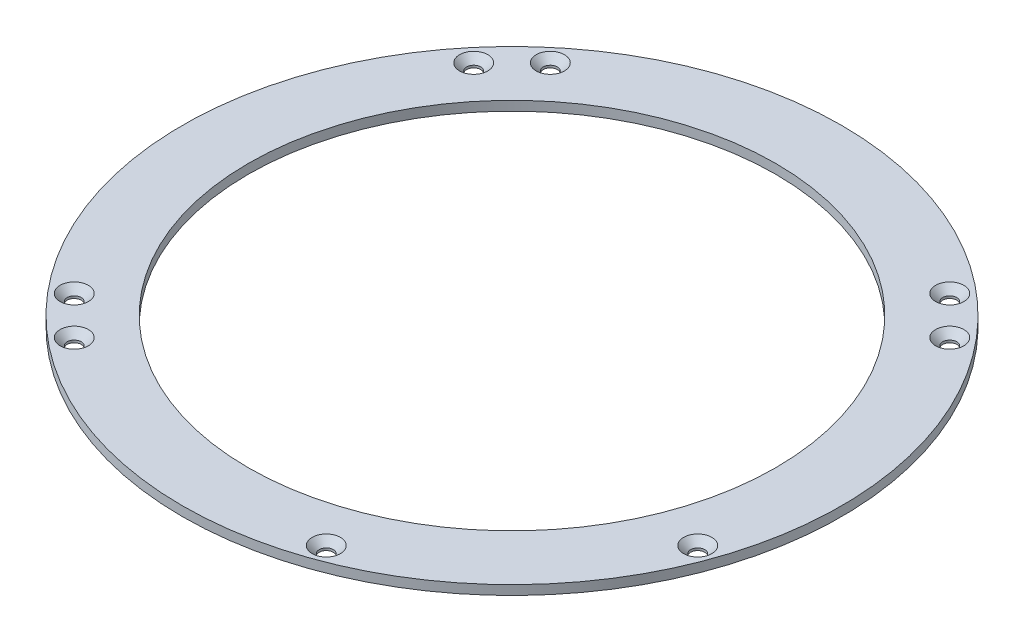
ISO-10303-21;
HEADER;
FILE_DESCRIPTION(('STEP AP214'),'2;1');
FILE_NAME('part.step','',(''),(''),'','','');
FILE_SCHEMA(('AUTOMOTIVE_DESIGN { 1 0 10303 214 1 1 1 1 }'));
ENDSEC;
DATA;
#1=APPLICATION_CONTEXT('core data for automotive mechanical design processes');
#2=APPLICATION_PROTOCOL_DEFINITION('international standard','automotive_design',2000,#1);
#3=PRODUCT_CONTEXT('',#1,'mechanical');
#4=PRODUCT('Part','Part','',(#3));
#5=PRODUCT_RELATED_PRODUCT_CATEGORY('part','',(#4));
#6=PRODUCT_DEFINITION_FORMATION('','',#4);
#7=PRODUCT_DEFINITION_CONTEXT('part definition',#1,'design');
#8=PRODUCT_DEFINITION('design','',#6,#7);
#9=PRODUCT_DEFINITION_SHAPE('','',#8);
#10=(LENGTH_UNIT() NAMED_UNIT(*) SI_UNIT(.MILLI.,.METRE.));
#11=(NAMED_UNIT(*) PLANE_ANGLE_UNIT() SI_UNIT($,.RADIAN.));
#12=(NAMED_UNIT(*) SI_UNIT($,.STERADIAN.) SOLID_ANGLE_UNIT());
#13=UNCERTAINTY_MEASURE_WITH_UNIT(LENGTH_MEASURE(1.E-05),#10,'distance_accuracy_value','');
#14=(GEOMETRIC_REPRESENTATION_CONTEXT(3) GLOBAL_UNCERTAINTY_ASSIGNED_CONTEXT((#13)) GLOBAL_UNIT_ASSIGNED_CONTEXT((#10,
#11,#12)) REPRESENTATION_CONTEXT('',''));
#15=CARTESIAN_POINT('',(0.,0.,0.));
#16=DIRECTION('',(0.,0.,1.));
#17=DIRECTION('',(1.,0.,0.));
#18=AXIS2_PLACEMENT_3D('',#15,#16,#17);
#19=CARTESIAN_POINT('',(0.,2.,0.));
#20=DIRECTION('',(0.,1.,0.));
#21=DIRECTION('',(0.,0.,1.));
#22=AXIS2_PLACEMENT_3D('',#19,#20,#21);
#23=PLANE('',#22);
#24=CARTESIAN_POINT('',(62.01971297187,2.,22.573329459494));
#25=DIRECTION('',(0.,1.,0.));
#26=DIRECTION('',(0.,0.,1.));
#27=AXIS2_PLACEMENT_3D('',#24,#25,#26);
#28=CIRCLE('',#27,2.99999999999998);
#29=CARTESIAN_POINT('',(62.01971297187,2.,25.5733294594939));
#30=VERTEX_POINT('',#29);
#31=EDGE_CURVE('E60',#30,#30,#28,.F.);
#32=ORIENTED_EDGE('',*,*,#31,.T.);
#33=EDGE_LOOP('',(#32));
#34=FACE_BOUND('',#33,.T.);
#35=CARTESIAN_POINT('',(50.5589332458526,2.,-42.4239822393115));
#36=DIRECTION('',(0.,1.,0.));
#37=DIRECTION('',(0.,0.,1.));
#38=AXIS2_PLACEMENT_3D('',#35,#36,#37);
#39=CIRCLE('',#38,3.00000000000003);
#40=CARTESIAN_POINT('',(50.5589332458526,2.,-39.4239822393115));
#41=VERTEX_POINT('',#40);
#42=EDGE_CURVE('E63',#41,#41,#39,.F.);
#43=ORIENTED_EDGE('',*,*,#42,.T.);
#44=EDGE_LOOP('',(#43));
#45=FACE_BOUND('',#44,.T.);
#46=CARTESIAN_POINT('',(42.4239822393117,2.,-50.5589332458525));
#47=DIRECTION('',(0.,1.,0.));
#48=DIRECTION('',(0.,0.,1.));
#49=AXIS2_PLACEMENT_3D('',#46,#47,#48);
#50=CIRCLE('',#49,3.00000000000003);
#51=CARTESIAN_POINT('',(42.4239822393117,2.,-47.5589332458525));
#52=VERTEX_POINT('',#51);
#53=EDGE_CURVE('E66',#52,#52,#50,.F.);
#54=ORIENTED_EDGE('',*,*,#53,.T.);
#55=EDGE_LOOP('',(#54));
#56=FACE_BOUND('',#55,.T.);
#57=CARTESIAN_POINT('',(-42.4239822393117,2.,-50.5589332458525));
#58=DIRECTION('',(0.,1.,0.));
#59=DIRECTION('',(0.,0.,1.));
#60=AXIS2_PLACEMENT_3D('',#57,#58,#59);
#61=CIRCLE('',#60,3.00000000000003);
#62=CARTESIAN_POINT('',(-42.4239822393117,2.,-47.5589332458525));
#63=VERTEX_POINT('',#62);
#64=EDGE_CURVE('E69',#63,#63,#61,.F.);
#65=ORIENTED_EDGE('',*,*,#64,.T.);
#66=EDGE_LOOP('',(#65));
#67=FACE_BOUND('',#66,.T.);
#68=CARTESIAN_POINT('',(-50.5589332458526,2.,-42.4239822393115));
#69=DIRECTION('',(0.,1.,0.));
#70=DIRECTION('',(0.,0.,1.));
#71=AXIS2_PLACEMENT_3D('',#68,#69,#70);
#72=CIRCLE('',#71,3.00000000000003);
#73=CARTESIAN_POINT('',(-50.5589332458526,2.,-39.4239822393115));
#74=VERTEX_POINT('',#73);
#75=EDGE_CURVE('E72',#74,#74,#72,.F.);
#76=ORIENTED_EDGE('',*,*,#75,.T.);
#77=EDGE_LOOP('',(#76));
#78=FACE_BOUND('',#77,.T.);
#79=CARTESIAN_POINT('',(-50.5589332458526,2.,42.4239822393115));
#80=DIRECTION('',(0.,1.,0.));
#81=DIRECTION('',(0.,0.,1.));
#82=AXIS2_PLACEMENT_3D('',#79,#80,#81);
#83=CIRCLE('',#82,3.00000000000003);
#84=CARTESIAN_POINT('',(-50.5589332458526,2.,45.4239822393115));
#85=VERTEX_POINT('',#84);
#86=EDGE_CURVE('E75',#85,#85,#83,.F.);
#87=ORIENTED_EDGE('',*,*,#86,.T.);
#88=EDGE_LOOP('',(#87));
#89=FACE_BOUND('',#88,.T.);
#90=CARTESIAN_POINT('',(-42.4239822393117,2.,50.5589332458525));
#91=DIRECTION('',(0.,1.,0.));
#92=DIRECTION('',(0.,0.,1.));
#93=AXIS2_PLACEMENT_3D('',#90,#91,#92);
#94=CIRCLE('',#93,3.00000000000003);
#95=CARTESIAN_POINT('',(-42.4239822393117,2.,53.5589332458525));
#96=VERTEX_POINT('',#95);
#97=EDGE_CURVE('E78',#96,#96,#94,.F.);
#98=ORIENTED_EDGE('',*,*,#97,.T.);
#99=EDGE_LOOP('',(#98));
#100=FACE_BOUND('',#99,.T.);
#101=CARTESIAN_POINT('',(22.5733294594942,2.,62.0197129718699));
#102=DIRECTION('',(0.,1.,0.));
#103=DIRECTION('',(0.,0.,1.));
#104=AXIS2_PLACEMENT_3D('',#101,#102,#103);
#105=CIRCLE('',#104,3.00000000000004);
#106=CARTESIAN_POINT('',(22.5733294594942,2.,65.01971297187));
#107=VERTEX_POINT('',#106);
#108=EDGE_CURVE('E81',#107,#107,#105,.F.);
#109=ORIENTED_EDGE('',*,*,#108,.T.);
#110=EDGE_LOOP('',(#109));
#111=FACE_BOUND('',#110,.T.);
#112=CARTESIAN_POINT('',(0.,2.,0.));
#113=DIRECTION('',(0.,1.,0.));
#114=DIRECTION('',(0.,0.,1.));
#115=AXIS2_PLACEMENT_3D('',#112,#113,#114);
#116=CIRCLE('',#115,70.);
#117=CARTESIAN_POINT('',(0.,2.,70.));
#118=VERTEX_POINT('',#117);
#119=EDGE_CURVE('E87',#118,#118,#116,.T.);
#120=ORIENTED_EDGE('',*,*,#119,.T.);
#121=EDGE_LOOP('',(#120));
#122=FACE_BOUND('',#121,.T.);
#123=CARTESIAN_POINT('',(0.,2.,0.));
#124=DIRECTION('',(0.,1.,0.));
#125=DIRECTION('',(0.,0.,1.));
#126=AXIS2_PLACEMENT_3D('',#123,#124,#125);
#127=CIRCLE('',#126,56.);
#128=CARTESIAN_POINT('',(0.,2.,56.));
#129=VERTEX_POINT('',#128);
#130=EDGE_CURVE('E116',#129,#129,#127,.T.);
#131=ORIENTED_EDGE('',*,*,#130,.F.);
#132=EDGE_LOOP('',(#131));
#133=FACE_BOUND('',#132,.T.);
#134=ADVANCED_FACE('F31',(#34,#45,#56,#67,#78,#89,#100,#111,#122,#133),#23,.T.);
#135=CARTESIAN_POINT('',(0.,0.,0.));
#136=DIRECTION('',(0.,1.,0.));
#137=DIRECTION('',(0.,0.,1.));
#138=AXIS2_PLACEMENT_3D('',#135,#136,#137);
#139=PLANE('',#138);
#140=CARTESIAN_POINT('',(50.5589332458526,0.,-42.4239822393115));
#141=DIRECTION('',(0.,1.,0.));
#142=DIRECTION('',(0.,0.,1.));
#143=AXIS2_PLACEMENT_3D('',#140,#141,#142);
#144=CIRCLE('',#143,1.50000000000001);
#145=CARTESIAN_POINT('',(50.5589332458526,0.,-40.9239822393115));
#146=VERTEX_POINT('',#145);
#147=EDGE_CURVE('E88',#146,#146,#144,.T.);
#148=ORIENTED_EDGE('',*,*,#147,.T.);
#149=EDGE_LOOP('',(#148));
#150=FACE_BOUND('',#149,.T.);
#151=CARTESIAN_POINT('',(22.5733294594942,0.,62.0197129718699));
#152=DIRECTION('',(0.,1.,0.));
#153=DIRECTION('',(0.,0.,1.));
#154=AXIS2_PLACEMENT_3D('',#151,#152,#153);
#155=CIRCLE('',#154,1.5);
#156=CARTESIAN_POINT('',(22.5733294594942,0.,63.5197129718699));
#157=VERTEX_POINT('',#156);
#158=EDGE_CURVE('E92',#157,#157,#155,.T.);
#159=ORIENTED_EDGE('',*,*,#158,.T.);
#160=EDGE_LOOP('',(#159));
#161=FACE_BOUND('',#160,.T.);
#162=CARTESIAN_POINT('',(-50.5589332458526,0.,-42.4239822393115));
#163=DIRECTION('',(0.,1.,0.));
#164=DIRECTION('',(0.,0.,1.));
#165=AXIS2_PLACEMENT_3D('',#162,#163,#164);
#166=CIRCLE('',#165,1.50000000000001);
#167=CARTESIAN_POINT('',(-50.5589332458526,0.,-40.9239822393115));
#168=VERTEX_POINT('',#167);
#169=EDGE_CURVE('E95',#168,#168,#166,.T.);
#170=ORIENTED_EDGE('',*,*,#169,.T.);
#171=EDGE_LOOP('',(#170));
#172=FACE_BOUND('',#171,.T.);
#173=CARTESIAN_POINT('',(-42.4239822393117,0.,-50.5589332458525));
#174=DIRECTION('',(0.,1.,0.));
#175=DIRECTION('',(0.,0.,1.));
#176=AXIS2_PLACEMENT_3D('',#173,#174,#175);
#177=CIRCLE('',#176,1.5);
#178=CARTESIAN_POINT('',(-42.4239822393117,0.,-49.0589332458525));
#179=VERTEX_POINT('',#178);
#180=EDGE_CURVE('E98',#179,#179,#177,.T.);
#181=ORIENTED_EDGE('',*,*,#180,.T.);
#182=EDGE_LOOP('',(#181));
#183=FACE_BOUND('',#182,.T.);
#184=CARTESIAN_POINT('',(-50.5589332458526,0.,42.4239822393115));
#185=DIRECTION('',(0.,1.,0.));
#186=DIRECTION('',(0.,0.,1.));
#187=AXIS2_PLACEMENT_3D('',#184,#185,#186);
#188=CIRCLE('',#187,1.50000000000001);
#189=CARTESIAN_POINT('',(-50.5589332458526,0.,43.9239822393115));
#190=VERTEX_POINT('',#189);
#191=EDGE_CURVE('E101',#190,#190,#188,.T.);
#192=ORIENTED_EDGE('',*,*,#191,.T.);
#193=EDGE_LOOP('',(#192));
#194=FACE_BOUND('',#193,.T.);
#195=CARTESIAN_POINT('',(-42.4239822393117,0.,50.5589332458525));
#196=DIRECTION('',(0.,1.,0.));
#197=DIRECTION('',(0.,0.,1.));
#198=AXIS2_PLACEMENT_3D('',#195,#196,#197);
#199=CIRCLE('',#198,1.5);
#200=CARTESIAN_POINT('',(-42.4239822393117,0.,52.0589332458525));
#201=VERTEX_POINT('',#200);
#202=EDGE_CURVE('E104',#201,#201,#199,.T.);
#203=ORIENTED_EDGE('',*,*,#202,.T.);
#204=EDGE_LOOP('',(#203));
#205=FACE_BOUND('',#204,.T.);
#206=CARTESIAN_POINT('',(62.01971297187,0.,22.573329459494));
#207=DIRECTION('',(0.,1.,0.));
#208=DIRECTION('',(0.,0.,1.));
#209=AXIS2_PLACEMENT_3D('',#206,#207,#208);
#210=CIRCLE('',#209,1.5);
#211=CARTESIAN_POINT('',(62.01971297187,0.,24.073329459494));
#212=VERTEX_POINT('',#211);
#213=EDGE_CURVE('E107',#212,#212,#210,.T.);
#214=ORIENTED_EDGE('',*,*,#213,.T.);
#215=EDGE_LOOP('',(#214));
#216=FACE_BOUND('',#215,.T.);
#217=CARTESIAN_POINT('',(42.4239822393117,0.,-50.5589332458525));
#218=DIRECTION('',(0.,1.,0.));
#219=DIRECTION('',(0.,0.,1.));
#220=AXIS2_PLACEMENT_3D('',#217,#218,#219);
#221=CIRCLE('',#220,1.5);
#222=CARTESIAN_POINT('',(42.4239822393117,0.,-49.0589332458525));
#223=VERTEX_POINT('',#222);
#224=EDGE_CURVE('E110',#223,#223,#221,.T.);
#225=ORIENTED_EDGE('',*,*,#224,.T.);
#226=EDGE_LOOP('',(#225));
#227=FACE_BOUND('',#226,.T.);
#228=CARTESIAN_POINT('',(0.,0.,0.));
#229=DIRECTION('',(0.,1.,0.));
#230=DIRECTION('',(0.,0.,1.));
#231=AXIS2_PLACEMENT_3D('',#228,#229,#230);
#232=CIRCLE('',#231,70.);
#233=CARTESIAN_POINT('',(0.,0.,70.));
#234=VERTEX_POINT('',#233);
#235=EDGE_CURVE('E113',#234,#234,#232,.T.);
#236=ORIENTED_EDGE('',*,*,#235,.F.);
#237=EDGE_LOOP('',(#236));
#238=FACE_BOUND('',#237,.T.);
#239=CARTESIAN_POINT('',(0.,0.,0.));
#240=DIRECTION('',(0.,1.,0.));
#241=DIRECTION('',(0.,0.,1.));
#242=AXIS2_PLACEMENT_3D('',#239,#240,#241);
#243=CIRCLE('',#242,56.);
#244=CARTESIAN_POINT('',(0.,0.,56.));
#245=VERTEX_POINT('',#244);
#246=EDGE_CURVE('E91',#245,#245,#243,.T.);
#247=ORIENTED_EDGE('',*,*,#246,.T.);
#248=EDGE_LOOP('',(#247));
#249=FACE_BOUND('',#248,.T.);
#250=ADVANCED_FACE('F128',(#150,#161,#172,#183,#194,#205,#216,#227,#238,#249),#139,.F.);
#251=CARTESIAN_POINT('',(0.,2.,0.));
#252=DIRECTION('',(0.,-1.,0.));
#253=DIRECTION('',(0.,0.,-1.));
#254=AXIS2_PLACEMENT_3D('',#251,#252,#253);
#255=CYLINDRICAL_SURFACE('',#254,70.);
#256=ORIENTED_EDGE('',*,*,#119,.F.);
#257=EDGE_LOOP('',(#256));
#258=FACE_BOUND('',#257,.T.);
#259=ORIENTED_EDGE('',*,*,#235,.T.);
#260=EDGE_LOOP('',(#259));
#261=FACE_BOUND('',#260,.T.);
#262=ADVANCED_FACE('F134',(#258,#261),#255,.T.);
#263=CARTESIAN_POINT('',(0.,2.,0.));
#264=DIRECTION('',(0.,-1.,0.));
#265=DIRECTION('',(0.,0.,-1.));
#266=AXIS2_PLACEMENT_3D('',#263,#264,#265);
#267=CYLINDRICAL_SURFACE('',#266,56.);
#268=ORIENTED_EDGE('',*,*,#130,.T.);
#269=EDGE_LOOP('',(#268));
#270=FACE_BOUND('',#269,.T.);
#271=ORIENTED_EDGE('',*,*,#246,.F.);
#272=EDGE_LOOP('',(#271));
#273=FACE_BOUND('',#272,.T.);
#274=ADVANCED_FACE('F124',(#270,#273),#267,.F.);
#275=CARTESIAN_POINT('',(42.4239822393117,-1.,-50.5589332458525));
#276=DIRECTION('',(0.,1.,0.));
#277=DIRECTION('',(0.,0.,1.));
#278=AXIS2_PLACEMENT_3D('',#275,#276,#277);
#279=CYLINDRICAL_SURFACE('',#278,1.5);
#280=CARTESIAN_POINT('',(42.4239822393117,0.499999999999996,-50.5589332458525));
#281=DIRECTION('',(0.,1.,0.));
#282=DIRECTION('',(0.,0.,1.));
#283=AXIS2_PLACEMENT_3D('',#280,#281,#282);
#284=CIRCLE('',#283,1.5);
#285=CARTESIAN_POINT('',(42.4239822393117,0.499999999999996,-49.0589332458525));
#286=VERTEX_POINT('',#285);
#287=EDGE_CURVE('E54',#286,#286,#284,.T.);
#288=ORIENTED_EDGE('',*,*,#287,.T.);
#289=EDGE_LOOP('',(#288));
#290=FACE_BOUND('',#289,.T.);
#291=ORIENTED_EDGE('',*,*,#224,.F.);
#292=EDGE_LOOP('',(#291));
#293=FACE_BOUND('',#292,.T.);
#294=ADVANCED_FACE('F188',(#290,#293),#279,.F.);
#295=CARTESIAN_POINT('',(62.01971297187,-1.,22.573329459494));
#296=DIRECTION('',(0.,1.,0.));
#297=DIRECTION('',(0.,0.,1.));
#298=AXIS2_PLACEMENT_3D('',#295,#296,#297);
#299=CYLINDRICAL_SURFACE('',#298,1.5);
#300=CARTESIAN_POINT('',(62.01971297187,0.500000000000017,22.573329459494));
#301=DIRECTION('',(0.,1.,0.));
#302=DIRECTION('',(0.,0.,1.));
#303=AXIS2_PLACEMENT_3D('',#300,#301,#302);
#304=CIRCLE('',#303,1.5);
#305=CARTESIAN_POINT('',(62.01971297187,0.500000000000017,24.073329459494));
#306=VERTEX_POINT('',#305);
#307=EDGE_CURVE('E84',#306,#306,#304,.T.);
#308=ORIENTED_EDGE('',*,*,#307,.T.);
#309=EDGE_LOOP('',(#308));
#310=FACE_BOUND('',#309,.T.);
#311=ORIENTED_EDGE('',*,*,#213,.F.);
#312=EDGE_LOOP('',(#311));
#313=FACE_BOUND('',#312,.T.);
#314=ADVANCED_FACE('F192',(#310,#313),#299,.F.);
#315=CARTESIAN_POINT('',(-42.4239822393117,-1.,50.5589332458525));
#316=DIRECTION('',(0.,1.,0.));
#317=DIRECTION('',(0.,0.,1.));
#318=AXIS2_PLACEMENT_3D('',#315,#316,#317);
#319=CYLINDRICAL_SURFACE('',#318,1.5);
#320=CARTESIAN_POINT('',(-42.4239822393117,0.499999999999996,50.5589332458525));
#321=DIRECTION('',(0.,1.,0.));
#322=DIRECTION('',(0.,0.,1.));
#323=AXIS2_PLACEMENT_3D('',#320,#321,#322);
#324=CIRCLE('',#323,1.5);
#325=CARTESIAN_POINT('',(-42.4239822393117,0.499999999999996,52.0589332458525));
#326=VERTEX_POINT('',#325);
#327=EDGE_CURVE('E38',#326,#326,#324,.T.);
#328=ORIENTED_EDGE('',*,*,#327,.T.);
#329=EDGE_LOOP('',(#328));
#330=FACE_BOUND('',#329,.T.);
#331=ORIENTED_EDGE('',*,*,#202,.F.);
#332=EDGE_LOOP('',(#331));
#333=FACE_BOUND('',#332,.T.);
#334=ADVANCED_FACE('F197',(#330,#333),#319,.F.);
#335=CARTESIAN_POINT('',(-50.5589332458526,-1.,42.4239822393115));
#336=DIRECTION('',(0.,1.,0.));
#337=DIRECTION('',(0.,0.,1.));
#338=AXIS2_PLACEMENT_3D('',#335,#336,#337);
#339=CYLINDRICAL_SURFACE('',#338,1.50000000000001);
#340=CARTESIAN_POINT('',(-50.5589332458526,0.500000000000005,42.4239822393115));
#341=DIRECTION('',(0.,1.,0.));
#342=DIRECTION('',(0.,0.,1.));
#343=AXIS2_PLACEMENT_3D('',#340,#341,#342);
#344=CIRCLE('',#343,1.50000000000001);
#345=CARTESIAN_POINT('',(-50.5589332458526,0.500000000000005,43.9239822393115));
#346=VERTEX_POINT('',#345);
#347=EDGE_CURVE('E42',#346,#346,#344,.T.);
#348=ORIENTED_EDGE('',*,*,#347,.T.);
#349=EDGE_LOOP('',(#348));
#350=FACE_BOUND('',#349,.T.);
#351=ORIENTED_EDGE('',*,*,#191,.F.);
#352=EDGE_LOOP('',(#351));
#353=FACE_BOUND('',#352,.T.);
#354=ADVANCED_FACE('F206',(#350,#353),#339,.F.);
#355=CARTESIAN_POINT('',(-42.4239822393117,-1.,-50.5589332458525));
#356=DIRECTION('',(0.,1.,0.));
#357=DIRECTION('',(0.,0.,1.));
#358=AXIS2_PLACEMENT_3D('',#355,#356,#357);
#359=CYLINDRICAL_SURFACE('',#358,1.5);
#360=CARTESIAN_POINT('',(-42.4239822393117,0.499999999999996,-50.5589332458525));
#361=DIRECTION('',(0.,1.,0.));
#362=DIRECTION('',(0.,0.,1.));
#363=AXIS2_PLACEMENT_3D('',#360,#361,#362);
#364=CIRCLE('',#363,1.5);
#365=CARTESIAN_POINT('',(-42.4239822393117,0.499999999999996,-49.0589332458525));
#366=VERTEX_POINT('',#365);
#367=EDGE_CURVE('E51',#366,#366,#364,.T.);
#368=ORIENTED_EDGE('',*,*,#367,.T.);
#369=EDGE_LOOP('',(#368));
#370=FACE_BOUND('',#369,.T.);
#371=ORIENTED_EDGE('',*,*,#180,.F.);
#372=EDGE_LOOP('',(#371));
#373=FACE_BOUND('',#372,.T.);
#374=ADVANCED_FACE('F202',(#370,#373),#359,.F.);
#375=CARTESIAN_POINT('',(-50.5589332458526,-1.,-42.4239822393115));
#376=DIRECTION('',(0.,1.,0.));
#377=DIRECTION('',(0.,0.,1.));
#378=AXIS2_PLACEMENT_3D('',#375,#376,#377);
#379=CYLINDRICAL_SURFACE('',#378,1.50000000000001);
#380=CARTESIAN_POINT('',(-50.5589332458526,0.500000000000005,-42.4239822393115));
#381=DIRECTION('',(0.,1.,0.));
#382=DIRECTION('',(0.,0.,1.));
#383=AXIS2_PLACEMENT_3D('',#380,#381,#382);
#384=CIRCLE('',#383,1.50000000000001);
#385=CARTESIAN_POINT('',(-50.5589332458526,0.500000000000005,-40.9239822393115));
#386=VERTEX_POINT('',#385);
#387=EDGE_CURVE('E46',#386,#386,#384,.T.);
#388=ORIENTED_EDGE('',*,*,#387,.T.);
#389=EDGE_LOOP('',(#388));
#390=FACE_BOUND('',#389,.T.);
#391=ORIENTED_EDGE('',*,*,#169,.F.);
#392=EDGE_LOOP('',(#391));
#393=FACE_BOUND('',#392,.T.);
#394=ADVANCED_FACE('F205',(#390,#393),#379,.F.);
#395=CARTESIAN_POINT('',(22.5733294594942,-1.,62.0197129718699));
#396=DIRECTION('',(0.,1.,0.));
#397=DIRECTION('',(0.,0.,1.));
#398=AXIS2_PLACEMENT_3D('',#395,#396,#397);
#399=CYLINDRICAL_SURFACE('',#398,1.5);
#400=CARTESIAN_POINT('',(22.5733294594942,0.499999999999993,62.0197129718699));
#401=DIRECTION('',(0.,1.,0.));
#402=DIRECTION('',(0.,0.,1.));
#403=AXIS2_PLACEMENT_3D('',#400,#401,#402);
#404=CIRCLE('',#403,1.5);
#405=CARTESIAN_POINT('',(22.5733294594942,0.499999999999993,63.5197129718699));
#406=VERTEX_POINT('',#405);
#407=EDGE_CURVE('E10',#406,#406,#404,.T.);
#408=ORIENTED_EDGE('',*,*,#407,.T.);
#409=EDGE_LOOP('',(#408));
#410=FACE_BOUND('',#409,.T.);
#411=ORIENTED_EDGE('',*,*,#158,.F.);
#412=EDGE_LOOP('',(#411));
#413=FACE_BOUND('',#412,.T.);
#414=ADVANCED_FACE('F210',(#410,#413),#399,.F.);
#415=CARTESIAN_POINT('',(50.5589332458526,-1.,-42.4239822393115));
#416=DIRECTION('',(0.,1.,0.));
#417=DIRECTION('',(0.,0.,1.));
#418=AXIS2_PLACEMENT_3D('',#415,#416,#417);
#419=CYLINDRICAL_SURFACE('',#418,1.50000000000001);
#420=CARTESIAN_POINT('',(50.5589332458526,0.500000000000005,-42.4239822393115));
#421=DIRECTION('',(0.,1.,0.));
#422=DIRECTION('',(0.,0.,1.));
#423=AXIS2_PLACEMENT_3D('',#420,#421,#422);
#424=CIRCLE('',#423,1.50000000000001);
#425=CARTESIAN_POINT('',(50.5589332458526,0.500000000000005,-40.9239822393115));
#426=VERTEX_POINT('',#425);
#427=EDGE_CURVE('E57',#426,#426,#424,.T.);
#428=ORIENTED_EDGE('',*,*,#427,.T.);
#429=EDGE_LOOP('',(#428));
#430=FACE_BOUND('',#429,.T.);
#431=ORIENTED_EDGE('',*,*,#147,.F.);
#432=EDGE_LOOP('',(#431));
#433=FACE_BOUND('',#432,.T.);
#434=ADVANCED_FACE('F148',(#430,#433),#419,.F.);
#435=CARTESIAN_POINT('',(62.01971297187,0.500000000000017,22.573329459494));
#436=DIRECTION('',(0.,1.,0.));
#437=DIRECTION('',(0.,0.,1.));
#438=AXIS2_PLACEMENT_3D('',#435,#436,#437);
#439=CONICAL_SURFACE('',#438,1.5,0.785398163397447);
#440=ORIENTED_EDGE('',*,*,#31,.F.);
#441=EDGE_LOOP('',(#440));
#442=FACE_BOUND('',#441,.T.);
#443=ORIENTED_EDGE('',*,*,#307,.F.);
#444=EDGE_LOOP('',(#443));
#445=FACE_BOUND('',#444,.T.);
#446=ADVANCED_FACE('F144',(#442,#445),#439,.F.);
#447=CARTESIAN_POINT('',(50.5589332458526,0.500000000000005,-42.4239822393115));
#448=DIRECTION('',(0.,1.,0.));
#449=DIRECTION('',(0.,0.,1.));
#450=AXIS2_PLACEMENT_3D('',#447,#448,#449);
#451=CONICAL_SURFACE('',#450,1.50000000000001,0.785398163397456);
#452=ORIENTED_EDGE('',*,*,#42,.F.);
#453=EDGE_LOOP('',(#452));
#454=FACE_BOUND('',#453,.T.);
#455=ORIENTED_EDGE('',*,*,#427,.F.);
#456=EDGE_LOOP('',(#455));
#457=FACE_BOUND('',#456,.T.);
#458=ADVANCED_FACE('F147',(#454,#457),#451,.F.);
#459=CARTESIAN_POINT('',(42.4239822393117,0.499999999999996,-50.5589332458525));
#460=DIRECTION('',(0.,1.,0.));
#461=DIRECTION('',(0.,0.,1.));
#462=AXIS2_PLACEMENT_3D('',#459,#460,#461);
#463=CONICAL_SURFACE('',#462,1.5,0.785398163397456);
#464=ORIENTED_EDGE('',*,*,#53,.F.);
#465=EDGE_LOOP('',(#464));
#466=FACE_BOUND('',#465,.T.);
#467=ORIENTED_EDGE('',*,*,#287,.F.);
#468=EDGE_LOOP('',(#467));
#469=FACE_BOUND('',#468,.T.);
#470=ADVANCED_FACE('F152',(#466,#469),#463,.F.);
#471=CARTESIAN_POINT('',(-42.4239822393117,0.499999999999996,-50.5589332458525));
#472=DIRECTION('',(0.,1.,0.));
#473=DIRECTION('',(0.,0.,1.));
#474=AXIS2_PLACEMENT_3D('',#471,#472,#473);
#475=CONICAL_SURFACE('',#474,1.5,0.785398163397456);
#476=ORIENTED_EDGE('',*,*,#64,.F.);
#477=EDGE_LOOP('',(#476));
#478=FACE_BOUND('',#477,.T.);
#479=ORIENTED_EDGE('',*,*,#367,.F.);
#480=EDGE_LOOP('',(#479));
#481=FACE_BOUND('',#480,.T.);
#482=ADVANCED_FACE('F156',(#478,#481),#475,.F.);
#483=CARTESIAN_POINT('',(-50.5589332458526,0.500000000000005,-42.4239822393115));
#484=DIRECTION('',(0.,1.,0.));
#485=DIRECTION('',(0.,0.,1.));
#486=AXIS2_PLACEMENT_3D('',#483,#484,#485);
#487=CONICAL_SURFACE('',#486,1.50000000000001,0.785398163397456);
#488=ORIENTED_EDGE('',*,*,#75,.F.);
#489=EDGE_LOOP('',(#488));
#490=FACE_BOUND('',#489,.T.);
#491=ORIENTED_EDGE('',*,*,#387,.F.);
#492=EDGE_LOOP('',(#491));
#493=FACE_BOUND('',#492,.T.);
#494=ADVANCED_FACE('F160',(#490,#493),#487,.F.);
#495=CARTESIAN_POINT('',(-50.5589332458526,0.500000000000005,42.4239822393115));
#496=DIRECTION('',(0.,1.,0.));
#497=DIRECTION('',(0.,0.,1.));
#498=AXIS2_PLACEMENT_3D('',#495,#496,#497);
#499=CONICAL_SURFACE('',#498,1.50000000000001,0.785398163397456);
#500=ORIENTED_EDGE('',*,*,#86,.F.);
#501=EDGE_LOOP('',(#500));
#502=FACE_BOUND('',#501,.T.);
#503=ORIENTED_EDGE('',*,*,#347,.F.);
#504=EDGE_LOOP('',(#503));
#505=FACE_BOUND('',#504,.T.);
#506=ADVANCED_FACE('F164',(#502,#505),#499,.F.);
#507=CARTESIAN_POINT('',(-42.4239822393117,0.499999999999996,50.5589332458525));
#508=DIRECTION('',(0.,1.,0.));
#509=DIRECTION('',(0.,0.,1.));
#510=AXIS2_PLACEMENT_3D('',#507,#508,#509);
#511=CONICAL_SURFACE('',#510,1.5,0.785398163397456);
#512=ORIENTED_EDGE('',*,*,#97,.F.);
#513=EDGE_LOOP('',(#512));
#514=FACE_BOUND('',#513,.T.);
#515=ORIENTED_EDGE('',*,*,#327,.F.);
#516=EDGE_LOOP('',(#515));
#517=FACE_BOUND('',#516,.T.);
#518=ADVANCED_FACE('F167',(#514,#517),#511,.F.);
#519=CARTESIAN_POINT('',(22.5733294594942,0.499999999999993,62.0197129718699));
#520=DIRECTION('',(0.,1.,0.));
#521=DIRECTION('',(0.,0.,1.));
#522=AXIS2_PLACEMENT_3D('',#519,#520,#521);
#523=CONICAL_SURFACE('',#522,1.5,0.785398163397456);
#524=ORIENTED_EDGE('',*,*,#108,.F.);
#525=EDGE_LOOP('',(#524));
#526=FACE_BOUND('',#525,.T.);
#527=ORIENTED_EDGE('',*,*,#407,.F.);
#528=EDGE_LOOP('',(#527));
#529=FACE_BOUND('',#528,.T.);
#530=ADVANCED_FACE('F33',(#526,#529),#523,.F.);
#531=CLOSED_SHELL('',(#134,#250,#262,#274,#294,#314,#334,#354,#374,#394,#414,#434,#446,#458,
#470,#482,#494,#506,#518,#530));
#532=MANIFOLD_SOLID_BREP('B2',#531);
#533=ADVANCED_BREP_SHAPE_REPRESENTATION('',(#18,#532),#14);
#534=SHAPE_DEFINITION_REPRESENTATION(#9,#533);
ENDSEC;
END-ISO-10303-21;
